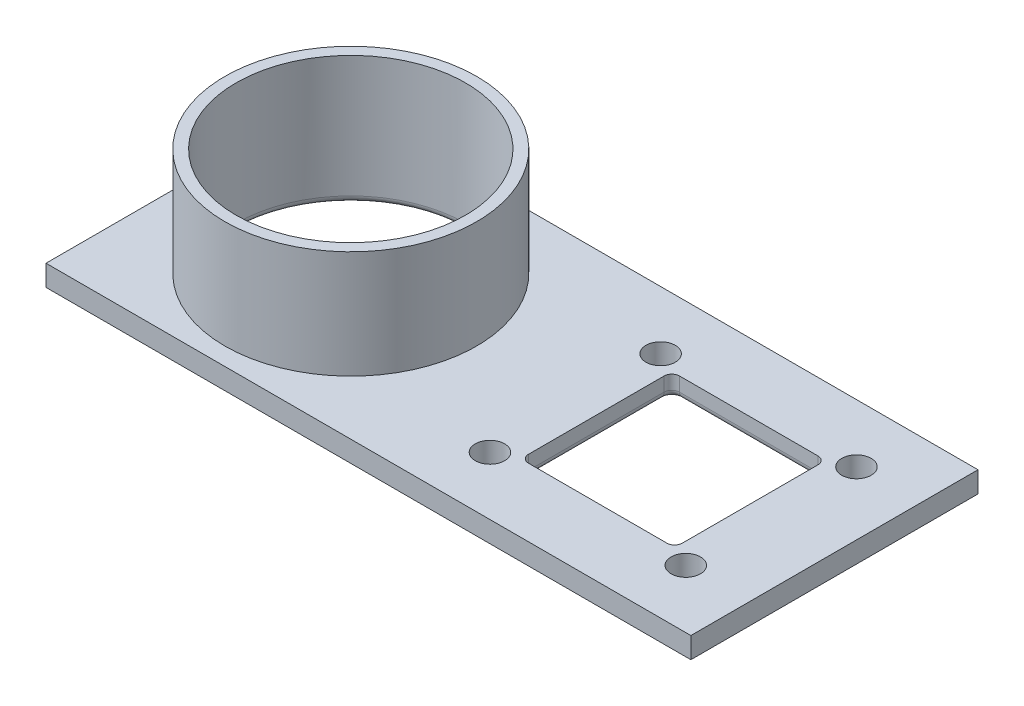
ISO-10303-21;
HEADER;
FILE_DESCRIPTION(('STEP AP214'),'2;1');
FILE_NAME('part.step','',(''),(''),'','','');
FILE_SCHEMA(('AUTOMOTIVE_DESIGN { 1 0 10303 214 1 1 1 1 }'));
ENDSEC;
DATA;
#1=APPLICATION_CONTEXT('core data for automotive mechanical design processes');
#2=APPLICATION_PROTOCOL_DEFINITION('international standard','automotive_design',2000,#1);
#3=PRODUCT_CONTEXT('',#1,'mechanical');
#4=PRODUCT('Part','Part','',(#3));
#5=PRODUCT_RELATED_PRODUCT_CATEGORY('part','',(#4));
#6=PRODUCT_DEFINITION_FORMATION('','',#4);
#7=PRODUCT_DEFINITION_CONTEXT('part definition',#1,'design');
#8=PRODUCT_DEFINITION('design','',#6,#7);
#9=PRODUCT_DEFINITION_SHAPE('','',#8);
#10=(LENGTH_UNIT() NAMED_UNIT(*) SI_UNIT(.MILLI.,.METRE.));
#11=(NAMED_UNIT(*) PLANE_ANGLE_UNIT() SI_UNIT($,.RADIAN.));
#12=(NAMED_UNIT(*) SI_UNIT($,.STERADIAN.) SOLID_ANGLE_UNIT());
#13=UNCERTAINTY_MEASURE_WITH_UNIT(LENGTH_MEASURE(1.E-05),#10,'distance_accuracy_value','');
#14=(GEOMETRIC_REPRESENTATION_CONTEXT(3) GLOBAL_UNCERTAINTY_ASSIGNED_CONTEXT((#13)) GLOBAL_UNIT_ASSIGNED_CONTEXT((#10,
#11,#12)) REPRESENTATION_CONTEXT('',''));
#15=CARTESIAN_POINT('',(0.,0.,0.));
#16=DIRECTION('',(0.,0.,1.));
#17=DIRECTION('',(1.,0.,0.));
#18=AXIS2_PLACEMENT_3D('',#15,#16,#17);
#19=CARTESIAN_POINT('',(0.,1.5,0.));
#20=DIRECTION('',(0.,-1.,0.));
#21=DIRECTION('',(0.,0.,-1.));
#22=AXIS2_PLACEMENT_3D('',#19,#20,#21);
#23=PLANE('',#22);
#24=CARTESIAN_POINT('',(-11.5244365156373,1.5,0.));
#25=DIRECTION('',(0.,-1.,0.));
#26=DIRECTION('',(0.,0.,-1.));
#27=AXIS2_PLACEMENT_3D('',#24,#25,#26);
#28=CIRCLE('',#27,9.);
#29=CARTESIAN_POINT('',(-11.5244365156373,1.5,-9.));
#30=VERTEX_POINT('',#29);
#31=EDGE_CURVE('E235',#30,#30,#28,.F.);
#32=ORIENTED_EDGE('',*,*,#31,.F.);
#33=EDGE_LOOP('',(#32));
#34=FACE_BOUND('',#33,.T.);
#35=CARTESIAN_POINT('',(4.52443651563732,1.5,6.1));
#36=DIRECTION('',(0.,1.,0.));
#37=DIRECTION('',(0.,0.,-1.));
#38=AXIS2_PLACEMENT_3D('',#35,#36,#37);
#39=CIRCLE('',#38,1.05);
#40=CARTESIAN_POINT('',(4.52443651563732,1.5,5.05));
#41=VERTEX_POINT('',#40);
#42=EDGE_CURVE('E448',#41,#41,#39,.T.);
#43=ORIENTED_EDGE('',*,*,#42,.F.);
#44=EDGE_LOOP('',(#43));
#45=FACE_BOUND('',#44,.T.);
#46=CARTESIAN_POINT('',(18.5244365156373,1.5,6.1));
#47=DIRECTION('',(0.,1.,0.));
#48=DIRECTION('',(0.,0.,-1.));
#49=AXIS2_PLACEMENT_3D('',#46,#47,#48);
#50=CIRCLE('',#49,1.05);
#51=CARTESIAN_POINT('',(18.5244365156373,1.5,5.05));
#52=VERTEX_POINT('',#51);
#53=EDGE_CURVE('E456',#52,#52,#50,.T.);
#54=ORIENTED_EDGE('',*,*,#53,.F.);
#55=EDGE_LOOP('',(#54));
#56=FACE_BOUND('',#55,.T.);
#57=CARTESIAN_POINT('',(18.5244365156373,1.5,-6.1));
#58=DIRECTION('',(0.,1.,0.));
#59=DIRECTION('',(0.,0.,1.));
#60=AXIS2_PLACEMENT_3D('',#57,#58,#59);
#61=CIRCLE('',#60,1.05);
#62=CARTESIAN_POINT('',(18.5244365156373,1.5,-5.05));
#63=VERTEX_POINT('',#62);
#64=EDGE_CURVE('E464',#63,#63,#61,.T.);
#65=ORIENTED_EDGE('',*,*,#64,.F.);
#66=EDGE_LOOP('',(#65));
#67=FACE_BOUND('',#66,.T.);
#68=CARTESIAN_POINT('',(4.52443651563732,1.5,-6.1));
#69=DIRECTION('',(0.,1.,0.));
#70=DIRECTION('',(0.,0.,1.));
#71=AXIS2_PLACEMENT_3D('',#68,#69,#70);
#72=CIRCLE('',#71,1.05);
#73=CARTESIAN_POINT('',(4.52443651563732,1.5,-5.05));
#74=VERTEX_POINT('',#73);
#75=EDGE_CURVE('E472',#74,#74,#72,.T.);
#76=ORIENTED_EDGE('',*,*,#75,.F.);
#77=EDGE_LOOP('',(#76));
#78=FACE_BOUND('',#77,.T.);
#79=DIRECTION('',(0.,0.,-1.));
#80=VECTOR('',#79,1.);
#81=CARTESIAN_POINT('',(23.0488730312746,1.5,10.2628876841373));
#82=LINE('',#81,#80);
#83=CARTESIAN_POINT('',(23.0488730312746,1.5,10.2628876841373));
#84=VERTEX_POINT('',#83);
#85=CARTESIAN_POINT('',(23.0488730312746,1.5,-10.2628876841373));
#86=VERTEX_POINT('',#85);
#87=EDGE_CURVE('E175',#84,#86,#82,.T.);
#88=ORIENTED_EDGE('',*,*,#87,.T.);
#89=DIRECTION('',(-1.,0.,0.));
#90=VECTOR('',#89,1.);
#91=CARTESIAN_POINT('',(-23.0488730312746,1.5,-10.2628876841373));
#92=LINE('',#91,#90);
#93=CARTESIAN_POINT('',(-23.0488730312746,1.5,-10.2628876841373));
#94=VERTEX_POINT('',#93);
#95=EDGE_CURVE('E163',#86,#94,#92,.T.);
#96=ORIENTED_EDGE('',*,*,#95,.T.);
#97=DIRECTION('',(0.,0.,1.));
#98=VECTOR('',#97,1.);
#99=CARTESIAN_POINT('',(-23.0488730312746,1.5,10.2628876841373));
#100=LINE('',#99,#98);
#101=CARTESIAN_POINT('',(-23.0488730312746,1.5,10.2628876841373));
#102=VERTEX_POINT('',#101);
#103=EDGE_CURVE('E174',#94,#102,#100,.T.);
#104=ORIENTED_EDGE('',*,*,#103,.T.);
#105=DIRECTION('',(1.,0.,0.));
#106=VECTOR('',#105,1.);
#107=CARTESIAN_POINT('',(-23.0488730312746,1.5,10.2628876841373));
#108=LINE('',#107,#106);
#109=EDGE_CURVE('E180',#102,#84,#108,.T.);
#110=ORIENTED_EDGE('',*,*,#109,.T.);
#111=EDGE_LOOP('',(#88,#96,#104,#110));
#112=FACE_BOUND('',#111,.T.);
#113=DIRECTION('',(0.,0.,-1.));
#114=VECTOR('',#113,1.);
#115=CARTESIAN_POINT('',(6.02443651563732,1.5,5.4));
#116=LINE('',#115,#114);
#117=CARTESIAN_POINT('',(6.02443651563732,1.5,4.85));
#118=VERTEX_POINT('',#117);
#119=CARTESIAN_POINT('',(6.02443651563732,1.5,-4.85));
#120=VERTEX_POINT('',#119);
#121=EDGE_CURVE('E444',#118,#120,#116,.T.);
#122=ORIENTED_EDGE('',*,*,#121,.T.);
#123=CARTESIAN_POINT('',(6.57443651563732,1.5,-4.85));
#124=DIRECTION('',(0.,-1.,0.));
#125=DIRECTION('',(0.,0.,-1.));
#126=AXIS2_PLACEMENT_3D('',#123,#124,#125);
#127=CIRCLE('',#126,0.55);
#128=CARTESIAN_POINT('',(6.57443651563732,1.5,-5.4));
#129=VERTEX_POINT('',#128);
#130=EDGE_CURVE('E232',#120,#129,#127,.T.);
#131=ORIENTED_EDGE('',*,*,#130,.T.);
#132=DIRECTION('',(1.,0.,0.));
#133=VECTOR('',#132,1.);
#134=CARTESIAN_POINT('',(6.02443651563732,1.5,-5.4));
#135=LINE('',#134,#133);
#136=CARTESIAN_POINT('',(16.4744365156373,1.5,-5.4));
#137=VERTEX_POINT('',#136);
#138=EDGE_CURVE('E426',#129,#137,#135,.T.);
#139=ORIENTED_EDGE('',*,*,#138,.T.);
#140=CARTESIAN_POINT('',(16.4744365156373,1.5,-4.85));
#141=DIRECTION('',(0.,-1.,0.));
#142=DIRECTION('',(0.,0.,-1.));
#143=AXIS2_PLACEMENT_3D('',#140,#141,#142);
#144=CIRCLE('',#143,0.55);
#145=CARTESIAN_POINT('',(17.0244365156373,1.5,-4.85));
#146=VERTEX_POINT('',#145);
#147=EDGE_CURVE('E229',#137,#146,#144,.T.);
#148=ORIENTED_EDGE('',*,*,#147,.T.);
#149=DIRECTION('',(0.,0.,-1.));
#150=VECTOR('',#149,1.);
#151=CARTESIAN_POINT('',(17.0244365156373,1.5,5.4));
#152=LINE('',#151,#150);
#153=CARTESIAN_POINT('',(17.0244365156373,1.5,4.85));
#154=VERTEX_POINT('',#153);
#155=EDGE_CURVE('E430',#154,#146,#152,.T.);
#156=ORIENTED_EDGE('',*,*,#155,.F.);
#157=CARTESIAN_POINT('',(16.4744365156373,1.5,4.85));
#158=DIRECTION('',(0.,-1.,0.));
#159=DIRECTION('',(0.,0.,-1.));
#160=AXIS2_PLACEMENT_3D('',#157,#158,#159);
#161=CIRCLE('',#160,0.55);
#162=CARTESIAN_POINT('',(16.4744365156373,1.5,5.4));
#163=VERTEX_POINT('',#162);
#164=EDGE_CURVE('E223',#154,#163,#161,.T.);
#165=ORIENTED_EDGE('',*,*,#164,.T.);
#166=DIRECTION('',(1.,0.,0.));
#167=VECTOR('',#166,1.);
#168=CARTESIAN_POINT('',(6.02443651563732,1.5,5.4));
#169=LINE('',#168,#167);
#170=CARTESIAN_POINT('',(6.57443651563732,1.5,5.4));
#171=VERTEX_POINT('',#170);
#172=EDGE_CURVE('E435',#171,#163,#169,.T.);
#173=ORIENTED_EDGE('',*,*,#172,.F.);
#174=CARTESIAN_POINT('',(6.57443651563732,1.5,4.85));
#175=DIRECTION('',(0.,-1.,0.));
#176=DIRECTION('',(0.,0.,-1.));
#177=AXIS2_PLACEMENT_3D('',#174,#175,#176);
#178=CIRCLE('',#177,0.55);
#179=EDGE_CURVE('E226',#171,#118,#178,.T.);
#180=ORIENTED_EDGE('',*,*,#179,.T.);
#181=EDGE_LOOP('',(#122,#131,#139,#148,#156,#165,#173,#180));
#182=FACE_BOUND('',#181,.T.);
#183=ADVANCED_FACE('F47',(#34,#45,#56,#67,#78,#112,#182),#23,.F.);
#184=CARTESIAN_POINT('',(0.,0.,0.));
#185=DIRECTION('',(0.,-1.,0.));
#186=DIRECTION('',(0.,0.,-1.));
#187=AXIS2_PLACEMENT_3D('',#184,#185,#186);
#188=PLANE('',#187);
#189=CARTESIAN_POINT('',(-11.5244365156373,0.,0.));
#190=DIRECTION('',(0.,-1.,0.));
#191=DIRECTION('',(0.,0.,-1.));
#192=AXIS2_PLACEMENT_3D('',#189,#190,#191);
#193=CIRCLE('',#192,8.7);
#194=CARTESIAN_POINT('',(-11.5244365156373,0.,-8.7));
#195=VERTEX_POINT('',#194);
#196=EDGE_CURVE('E56',#195,#195,#193,.F.);
#197=ORIENTED_EDGE('',*,*,#196,.T.);
#198=EDGE_LOOP('',(#197));
#199=FACE_BOUND('',#198,.T.);
#200=CARTESIAN_POINT('',(16.4744365156373,0.,4.85));
#201=DIRECTION('',(0.,-1.,0.));
#202=DIRECTION('',(0.,0.,-1.));
#203=AXIS2_PLACEMENT_3D('',#200,#201,#202);
#204=CIRCLE('',#203,1.05);
#205=CARTESIAN_POINT('',(16.4744365156373,0.,5.9));
#206=VERTEX_POINT('',#205);
#207=CARTESIAN_POINT('',(17.5244365156373,0.,4.85));
#208=VERTEX_POINT('',#207);
#209=EDGE_CURVE('E257',#206,#208,#204,.F.);
#210=ORIENTED_EDGE('',*,*,#209,.T.);
#211=DIRECTION('',(0.,0.,-1.));
#212=VECTOR('',#211,1.);
#213=CARTESIAN_POINT('',(17.5244365156373,0.,-4.85));
#214=LINE('',#213,#212);
#215=CARTESIAN_POINT('',(17.5244365156373,0.,-4.85));
#216=VERTEX_POINT('',#215);
#217=EDGE_CURVE('E261',#208,#216,#214,.T.);
#218=ORIENTED_EDGE('',*,*,#217,.T.);
#219=CARTESIAN_POINT('',(16.4744365156373,0.,-4.85));
#220=DIRECTION('',(0.,-1.,0.));
#221=DIRECTION('',(0.,0.,-1.));
#222=AXIS2_PLACEMENT_3D('',#219,#220,#221);
#223=CIRCLE('',#222,1.05);
#224=CARTESIAN_POINT('',(16.4744365156373,0.,-5.9));
#225=VERTEX_POINT('',#224);
#226=EDGE_CURVE('E254',#216,#225,#223,.F.);
#227=ORIENTED_EDGE('',*,*,#226,.T.);
#228=DIRECTION('',(1.,0.,0.));
#229=VECTOR('',#228,1.);
#230=CARTESIAN_POINT('',(0.,0.,-5.9));
#231=LINE('',#230,#229);
#232=CARTESIAN_POINT('',(6.57443651563732,0.,-5.9));
#233=VERTEX_POINT('',#232);
#234=EDGE_CURVE('E248',#225,#233,#231,.F.);
#235=ORIENTED_EDGE('',*,*,#234,.T.);
#236=CARTESIAN_POINT('',(6.57443651563732,0.,-4.85));
#237=DIRECTION('',(0.,-1.,0.));
#238=DIRECTION('',(0.,0.,-1.));
#239=AXIS2_PLACEMENT_3D('',#236,#237,#238);
#240=CIRCLE('',#239,1.05);
#241=CARTESIAN_POINT('',(5.52443651563732,0.,-4.85));
#242=VERTEX_POINT('',#241);
#243=EDGE_CURVE('E242',#233,#242,#240,.F.);
#244=ORIENTED_EDGE('',*,*,#243,.T.);
#245=DIRECTION('',(0.,0.,-1.));
#246=VECTOR('',#245,1.);
#247=CARTESIAN_POINT('',(5.52443651563732,0.,0.));
#248=LINE('',#247,#246);
#249=CARTESIAN_POINT('',(5.52443651563732,0.,4.85));
#250=VERTEX_POINT('',#249);
#251=EDGE_CURVE('E239',#242,#250,#248,.F.);
#252=ORIENTED_EDGE('',*,*,#251,.T.);
#253=CARTESIAN_POINT('',(6.57443651563732,0.,4.85));
#254=DIRECTION('',(0.,-1.,0.));
#255=DIRECTION('',(0.,0.,-1.));
#256=AXIS2_PLACEMENT_3D('',#253,#254,#255);
#257=CIRCLE('',#256,1.05);
#258=CARTESIAN_POINT('',(6.57443651563732,0.,5.9));
#259=VERTEX_POINT('',#258);
#260=EDGE_CURVE('E245',#250,#259,#257,.F.);
#261=ORIENTED_EDGE('',*,*,#260,.T.);
#262=DIRECTION('',(1.,0.,0.));
#263=VECTOR('',#262,1.);
#264=CARTESIAN_POINT('',(16.4744365156373,0.,5.9));
#265=LINE('',#264,#263);
#266=EDGE_CURVE('E251',#259,#206,#265,.T.);
#267=ORIENTED_EDGE('',*,*,#266,.T.);
#268=EDGE_LOOP('',(#210,#218,#227,#235,#244,#252,#261,#267));
#269=FACE_BOUND('',#268,.T.);
#270=CARTESIAN_POINT('',(18.5244365156373,0.,6.1));
#271=DIRECTION('',(0.,1.,0.));
#272=DIRECTION('',(0.,0.,-1.));
#273=AXIS2_PLACEMENT_3D('',#270,#271,#272);
#274=CIRCLE('',#273,1.05);
#275=CARTESIAN_POINT('',(18.5244365156373,0.,5.05));
#276=VERTEX_POINT('',#275);
#277=EDGE_CURVE('E452',#276,#276,#274,.T.);
#278=ORIENTED_EDGE('',*,*,#277,.T.);
#279=EDGE_LOOP('',(#278));
#280=FACE_BOUND('',#279,.T.);
#281=CARTESIAN_POINT('',(4.52443651563732,0.,-6.1));
#282=DIRECTION('',(0.,1.,0.));
#283=DIRECTION('',(0.,0.,1.));
#284=AXIS2_PLACEMENT_3D('',#281,#282,#283);
#285=CIRCLE('',#284,1.05);
#286=CARTESIAN_POINT('',(4.52443651563732,0.,-5.05));
#287=VERTEX_POINT('',#286);
#288=EDGE_CURVE('E468',#287,#287,#285,.T.);
#289=ORIENTED_EDGE('',*,*,#288,.T.);
#290=EDGE_LOOP('',(#289));
#291=FACE_BOUND('',#290,.T.);
#292=DIRECTION('',(0.,0.,-1.));
#293=VECTOR('',#292,1.);
#294=CARTESIAN_POINT('',(23.0488730312746,0.,10.2628876841373));
#295=LINE('',#294,#293);
#296=CARTESIAN_POINT('',(23.0488730312746,0.,10.2628876841373));
#297=VERTEX_POINT('',#296);
#298=CARTESIAN_POINT('',(23.0488730312746,0.,-10.2628876841373));
#299=VERTEX_POINT('',#298);
#300=EDGE_CURVE('E189',#297,#299,#295,.T.);
#301=ORIENTED_EDGE('',*,*,#300,.F.);
#302=DIRECTION('',(1.,0.,0.));
#303=VECTOR('',#302,1.);
#304=CARTESIAN_POINT('',(-23.0488730312746,0.,10.2628876841373));
#305=LINE('',#304,#303);
#306=CARTESIAN_POINT('',(-23.0488730312746,0.,10.2628876841373));
#307=VERTEX_POINT('',#306);
#308=EDGE_CURVE('E185',#307,#297,#305,.T.);
#309=ORIENTED_EDGE('',*,*,#308,.F.);
#310=DIRECTION('',(0.,0.,1.));
#311=VECTOR('',#310,1.);
#312=CARTESIAN_POINT('',(-23.0488730312746,0.,10.2628876841373));
#313=LINE('',#312,#311);
#314=CARTESIAN_POINT('',(-23.0488730312746,0.,-10.2628876841373));
#315=VERTEX_POINT('',#314);
#316=EDGE_CURVE('E489',#315,#307,#313,.T.);
#317=ORIENTED_EDGE('',*,*,#316,.F.);
#318=DIRECTION('',(-1.,0.,0.));
#319=VECTOR('',#318,1.);
#320=CARTESIAN_POINT('',(-23.0488730312746,0.,-10.2628876841373));
#321=LINE('',#320,#319);
#322=EDGE_CURVE('E486',#299,#315,#321,.T.);
#323=ORIENTED_EDGE('',*,*,#322,.F.);
#324=EDGE_LOOP('',(#301,#309,#317,#323));
#325=FACE_BOUND('',#324,.T.);
#326=CARTESIAN_POINT('',(18.5244365156373,0.,-6.1));
#327=DIRECTION('',(0.,1.,0.));
#328=DIRECTION('',(0.,0.,1.));
#329=AXIS2_PLACEMENT_3D('',#326,#327,#328);
#330=CIRCLE('',#329,1.05);
#331=CARTESIAN_POINT('',(18.5244365156373,0.,-5.05));
#332=VERTEX_POINT('',#331);
#333=EDGE_CURVE('E460',#332,#332,#330,.T.);
#334=ORIENTED_EDGE('',*,*,#333,.T.);
#335=EDGE_LOOP('',(#334));
#336=FACE_BOUND('',#335,.T.);
#337=CARTESIAN_POINT('',(4.52443651563732,0.,6.1));
#338=DIRECTION('',(0.,1.,0.));
#339=DIRECTION('',(0.,0.,-1.));
#340=AXIS2_PLACEMENT_3D('',#337,#338,#339);
#341=CIRCLE('',#340,1.05);
#342=CARTESIAN_POINT('',(4.52443651563732,0.,5.05));
#343=VERTEX_POINT('',#342);
#344=EDGE_CURVE('E447',#343,#343,#341,.T.);
#345=ORIENTED_EDGE('',*,*,#344,.T.);
#346=EDGE_LOOP('',(#345));
#347=FACE_BOUND('',#346,.T.);
#348=ADVANCED_FACE('F321',(#199,#269,#280,#291,#325,#336,#347),#188,.T.);
#349=CARTESIAN_POINT('',(23.0488730312746,1.5,10.2628876841373));
#350=DIRECTION('',(-1.,0.,0.));
#351=DIRECTION('',(0.,0.,1.));
#352=AXIS2_PLACEMENT_3D('',#349,#350,#351);
#353=PLANE('',#352);
#354=ORIENTED_EDGE('',*,*,#300,.T.);
#355=DIRECTION('',(0.,-1.,0.));
#356=VECTOR('',#355,1.);
#357=CARTESIAN_POINT('',(23.0488730312746,1.5,-10.2628876841373));
#358=LINE('',#357,#356);
#359=EDGE_CURVE('E167',#86,#299,#358,.T.);
#360=ORIENTED_EDGE('',*,*,#359,.F.);
#361=ORIENTED_EDGE('',*,*,#87,.F.);
#362=DIRECTION('',(0.,-1.,0.));
#363=VECTOR('',#362,1.);
#364=CARTESIAN_POINT('',(23.0488730312746,1.5,10.2628876841373));
#365=LINE('',#364,#363);
#366=EDGE_CURVE('E483',#84,#297,#365,.T.);
#367=ORIENTED_EDGE('',*,*,#366,.T.);
#368=EDGE_LOOP('',(#354,#360,#361,#367));
#369=FACE_BOUND('',#368,.T.);
#370=ADVANCED_FACE('F187',(#369),#353,.F.);
#371=CARTESIAN_POINT('',(-23.0488730312746,1.5,-10.2628876841373));
#372=DIRECTION('',(0.,0.,1.));
#373=DIRECTION('',(1.,0.,0.));
#374=AXIS2_PLACEMENT_3D('',#371,#372,#373);
#375=PLANE('',#374);
#376=ORIENTED_EDGE('',*,*,#322,.T.);
#377=DIRECTION('',(0.,-1.,0.));
#378=VECTOR('',#377,1.);
#379=CARTESIAN_POINT('',(-23.0488730312746,1.5,-10.2628876841373));
#380=LINE('',#379,#378);
#381=EDGE_CURVE('E170',#94,#315,#380,.T.);
#382=ORIENTED_EDGE('',*,*,#381,.F.);
#383=ORIENTED_EDGE('',*,*,#95,.F.);
#384=ORIENTED_EDGE('',*,*,#359,.T.);
#385=EDGE_LOOP('',(#376,#382,#383,#384));
#386=FACE_BOUND('',#385,.T.);
#387=ADVANCED_FACE('F165',(#386),#375,.F.);
#388=CARTESIAN_POINT('',(-23.0488730312746,1.5,10.2628876841373));
#389=DIRECTION('',(1.,0.,0.));
#390=DIRECTION('',(0.,0.,-1.));
#391=AXIS2_PLACEMENT_3D('',#388,#389,#390);
#392=PLANE('',#391);
#393=ORIENTED_EDGE('',*,*,#316,.T.);
#394=DIRECTION('',(0.,-1.,0.));
#395=VECTOR('',#394,1.);
#396=CARTESIAN_POINT('',(-23.0488730312746,1.5,10.2628876841373));
#397=LINE('',#396,#395);
#398=EDGE_CURVE('E198',#102,#307,#397,.T.);
#399=ORIENTED_EDGE('',*,*,#398,.F.);
#400=ORIENTED_EDGE('',*,*,#103,.F.);
#401=ORIENTED_EDGE('',*,*,#381,.T.);
#402=EDGE_LOOP('',(#393,#399,#400,#401));
#403=FACE_BOUND('',#402,.T.);
#404=ADVANCED_FACE('F353',(#403),#392,.F.);
#405=CARTESIAN_POINT('',(-23.0488730312746,1.5,10.2628876841373));
#406=DIRECTION('',(0.,0.,-1.));
#407=DIRECTION('',(-1.,0.,0.));
#408=AXIS2_PLACEMENT_3D('',#405,#406,#407);
#409=PLANE('',#408);
#410=ORIENTED_EDGE('',*,*,#308,.T.);
#411=ORIENTED_EDGE('',*,*,#366,.F.);
#412=ORIENTED_EDGE('',*,*,#109,.F.);
#413=ORIENTED_EDGE('',*,*,#398,.T.);
#414=EDGE_LOOP('',(#410,#411,#412,#413));
#415=FACE_BOUND('',#414,.T.);
#416=ADVANCED_FACE('F350',(#415),#409,.F.);
#417=CARTESIAN_POINT('',(4.52443651563732,1.5,-6.1));
#418=DIRECTION('',(0.,-1.,0.));
#419=DIRECTION('',(0.,0.,-1.));
#420=AXIS2_PLACEMENT_3D('',#417,#418,#419);
#421=CYLINDRICAL_SURFACE('',#420,1.05);
#422=ORIENTED_EDGE('',*,*,#75,.T.);
#423=EDGE_LOOP('',(#422));
#424=FACE_BOUND('',#423,.T.);
#425=ORIENTED_EDGE('',*,*,#288,.F.);
#426=EDGE_LOOP('',(#425));
#427=FACE_BOUND('',#426,.T.);
#428=ADVANCED_FACE('F347',(#424,#427),#421,.F.);
#429=CARTESIAN_POINT('',(18.5244365156373,1.5,-6.1));
#430=DIRECTION('',(0.,-1.,0.));
#431=DIRECTION('',(0.,0.,-1.));
#432=AXIS2_PLACEMENT_3D('',#429,#430,#431);
#433=CYLINDRICAL_SURFACE('',#432,1.05);
#434=ORIENTED_EDGE('',*,*,#64,.T.);
#435=EDGE_LOOP('',(#434));
#436=FACE_BOUND('',#435,.T.);
#437=ORIENTED_EDGE('',*,*,#333,.F.);
#438=EDGE_LOOP('',(#437));
#439=FACE_BOUND('',#438,.T.);
#440=ADVANCED_FACE('F516',(#436,#439),#433,.F.);
#441=CARTESIAN_POINT('',(18.5244365156373,1.5,6.1));
#442=DIRECTION('',(0.,-1.,0.));
#443=DIRECTION('',(0.,0.,-1.));
#444=AXIS2_PLACEMENT_3D('',#441,#442,#443);
#445=CYLINDRICAL_SURFACE('',#444,1.05);
#446=ORIENTED_EDGE('',*,*,#53,.T.);
#447=EDGE_LOOP('',(#446));
#448=FACE_BOUND('',#447,.T.);
#449=ORIENTED_EDGE('',*,*,#277,.F.);
#450=EDGE_LOOP('',(#449));
#451=FACE_BOUND('',#450,.T.);
#452=ADVANCED_FACE('F507',(#448,#451),#445,.F.);
#453=CARTESIAN_POINT('',(4.52443651563732,1.5,6.1));
#454=DIRECTION('',(0.,-1.,0.));
#455=DIRECTION('',(0.,0.,-1.));
#456=AXIS2_PLACEMENT_3D('',#453,#454,#455);
#457=CYLINDRICAL_SURFACE('',#456,1.05);
#458=ORIENTED_EDGE('',*,*,#42,.T.);
#459=EDGE_LOOP('',(#458));
#460=FACE_BOUND('',#459,.T.);
#461=ORIENTED_EDGE('',*,*,#344,.F.);
#462=EDGE_LOOP('',(#461));
#463=FACE_BOUND('',#462,.T.);
#464=ADVANCED_FACE('F506',(#460,#463),#457,.F.);
#465=CARTESIAN_POINT('',(6.02443651563732,0.,-5.4));
#466=DIRECTION('',(0.,0.,1.));
#467=DIRECTION('',(1.,0.,0.));
#468=AXIS2_PLACEMENT_3D('',#465,#466,#467);
#469=PLANE('',#468);
#470=DIRECTION('',(0.,1.,0.));
#471=VECTOR('',#470,1.);
#472=CARTESIAN_POINT('',(6.57443651563732,0.,-5.4));
#473=LINE('',#472,#471);
#474=CARTESIAN_POINT('',(6.57443651563732,0.5,-5.4));
#475=VERTEX_POINT('',#474);
#476=EDGE_CURVE('E217',#129,#475,#473,.F.);
#477=ORIENTED_EDGE('',*,*,#476,.T.);
#478=DIRECTION('',(1.,0.,0.));
#479=VECTOR('',#478,1.);
#480=CARTESIAN_POINT('',(6.02443651563732,0.5,-5.4));
#481=LINE('',#480,#479);
#482=CARTESIAN_POINT('',(16.4744365156373,0.5,-5.4));
#483=VERTEX_POINT('',#482);
#484=EDGE_CURVE('E282',#475,#483,#481,.T.);
#485=ORIENTED_EDGE('',*,*,#484,.T.);
#486=DIRECTION('',(0.,1.,0.));
#487=VECTOR('',#486,1.);
#488=CARTESIAN_POINT('',(16.4744365156373,0.,-5.4));
#489=LINE('',#488,#487);
#490=EDGE_CURVE('E220',#483,#137,#489,.T.);
#491=ORIENTED_EDGE('',*,*,#490,.T.);
#492=ORIENTED_EDGE('',*,*,#138,.F.);
#493=EDGE_LOOP('',(#477,#485,#491,#492));
#494=FACE_BOUND('',#493,.T.);
#495=ADVANCED_FACE('F419',(#494),#469,.T.);
#496=CARTESIAN_POINT('',(17.0244365156373,0.,5.4));
#497=DIRECTION('',(1.,0.,0.));
#498=DIRECTION('',(0.,0.,-1.));
#499=AXIS2_PLACEMENT_3D('',#496,#497,#498);
#500=PLANE('',#499);
#501=DIRECTION('',(0.,1.,0.));
#502=VECTOR('',#501,1.);
#503=CARTESIAN_POINT('',(17.0244365156373,0.,-4.85));
#504=LINE('',#503,#502);
#505=CARTESIAN_POINT('',(17.0244365156373,0.5,-4.85));
#506=VERTEX_POINT('',#505);
#507=EDGE_CURVE('E191',#146,#506,#504,.F.);
#508=ORIENTED_EDGE('',*,*,#507,.T.);
#509=DIRECTION('',(0.,0.,-1.));
#510=VECTOR('',#509,1.);
#511=CARTESIAN_POINT('',(17.0244365156373,0.5,4.85));
#512=LINE('',#511,#510);
#513=CARTESIAN_POINT('',(17.0244365156373,0.5,4.85));
#514=VERTEX_POINT('',#513);
#515=EDGE_CURVE('E279',#506,#514,#512,.F.);
#516=ORIENTED_EDGE('',*,*,#515,.T.);
#517=DIRECTION('',(0.,1.,0.));
#518=VECTOR('',#517,1.);
#519=CARTESIAN_POINT('',(17.0244365156373,1.5,4.85));
#520=LINE('',#519,#518);
#521=EDGE_CURVE('E196',#514,#154,#520,.T.);
#522=ORIENTED_EDGE('',*,*,#521,.T.);
#523=ORIENTED_EDGE('',*,*,#155,.T.);
#524=EDGE_LOOP('',(#508,#516,#522,#523));
#525=FACE_BOUND('',#524,.T.);
#526=ADVANCED_FACE('F514',(#525),#500,.F.);
#527=CARTESIAN_POINT('',(6.02443651563732,0.,5.4));
#528=DIRECTION('',(0.,0.,1.));
#529=DIRECTION('',(1.,0.,0.));
#530=AXIS2_PLACEMENT_3D('',#527,#528,#529);
#531=PLANE('',#530);
#532=DIRECTION('',(0.,1.,0.));
#533=VECTOR('',#532,1.);
#534=CARTESIAN_POINT('',(16.4744365156373,0.,5.4));
#535=LINE('',#534,#533);
#536=CARTESIAN_POINT('',(16.4744365156373,0.5,5.4));
#537=VERTEX_POINT('',#536);
#538=EDGE_CURVE('E207',#163,#537,#535,.F.);
#539=ORIENTED_EDGE('',*,*,#538,.T.);
#540=DIRECTION('',(1.,0.,0.));
#541=VECTOR('',#540,1.);
#542=CARTESIAN_POINT('',(6.57443651563732,0.5,5.4));
#543=LINE('',#542,#541);
#544=CARTESIAN_POINT('',(6.57443651563732,0.5,5.4));
#545=VERTEX_POINT('',#544);
#546=EDGE_CURVE('E276',#537,#545,#543,.F.);
#547=ORIENTED_EDGE('',*,*,#546,.T.);
#548=DIRECTION('',(0.,1.,0.));
#549=VECTOR('',#548,1.);
#550=CARTESIAN_POINT('',(6.57443651563732,0.,5.4));
#551=LINE('',#550,#549);
#552=EDGE_CURVE('E204',#545,#171,#551,.T.);
#553=ORIENTED_EDGE('',*,*,#552,.T.);
#554=ORIENTED_EDGE('',*,*,#172,.T.);
#555=EDGE_LOOP('',(#539,#547,#553,#554));
#556=FACE_BOUND('',#555,.T.);
#557=ADVANCED_FACE('F597',(#556),#531,.F.);
#558=CARTESIAN_POINT('',(6.02443651563732,0.,5.4));
#559=DIRECTION('',(1.,0.,0.));
#560=DIRECTION('',(0.,0.,-1.));
#561=AXIS2_PLACEMENT_3D('',#558,#559,#560);
#562=PLANE('',#561);
#563=DIRECTION('',(0.,1.,0.));
#564=VECTOR('',#563,1.);
#565=CARTESIAN_POINT('',(6.02443651563732,0.,4.85));
#566=LINE('',#565,#564);
#567=CARTESIAN_POINT('',(6.02443651563732,0.5,4.85));
#568=VERTEX_POINT('',#567);
#569=EDGE_CURVE('E214',#118,#568,#566,.F.);
#570=ORIENTED_EDGE('',*,*,#569,.T.);
#571=DIRECTION('',(0.,0.,-1.));
#572=VECTOR('',#571,1.);
#573=CARTESIAN_POINT('',(6.02443651563732,0.5,5.4));
#574=LINE('',#573,#572);
#575=CARTESIAN_POINT('',(6.02443651563732,0.5,-4.85));
#576=VERTEX_POINT('',#575);
#577=EDGE_CURVE('E63',#568,#576,#574,.T.);
#578=ORIENTED_EDGE('',*,*,#577,.T.);
#579=DIRECTION('',(0.,1.,0.));
#580=VECTOR('',#579,1.);
#581=CARTESIAN_POINT('',(6.02443651563732,1.5,-4.85));
#582=LINE('',#581,#580);
#583=EDGE_CURVE('E211',#576,#120,#582,.T.);
#584=ORIENTED_EDGE('',*,*,#583,.T.);
#585=ORIENTED_EDGE('',*,*,#121,.F.);
#586=EDGE_LOOP('',(#570,#578,#584,#585));
#587=FACE_BOUND('',#586,.T.);
#588=ADVANCED_FACE('F366',(#587),#562,.T.);
#589=CARTESIAN_POINT('',(16.4744365156373,0.,4.85));
#590=DIRECTION('',(0.,-1.,0.));
#591=DIRECTION('',(0.,0.,-1.));
#592=AXIS2_PLACEMENT_3D('',#589,#590,#591);
#593=CYLINDRICAL_SURFACE('',#592,0.55);
#594=ORIENTED_EDGE('',*,*,#521,.F.);
#595=CARTESIAN_POINT('',(16.4744365156373,0.5,4.85));
#596=DIRECTION('',(0.,-1.,0.));
#597=DIRECTION('',(0.,0.,-1.));
#598=AXIS2_PLACEMENT_3D('',#595,#596,#597);
#599=CIRCLE('',#598,0.55);
#600=EDGE_CURVE('E264',#514,#537,#599,.T.);
#601=ORIENTED_EDGE('',*,*,#600,.T.);
#602=ORIENTED_EDGE('',*,*,#538,.F.);
#603=ORIENTED_EDGE('',*,*,#164,.F.);
#604=EDGE_LOOP('',(#594,#601,#602,#603));
#605=FACE_BOUND('',#604,.T.);
#606=ADVANCED_FACE('F362',(#605),#593,.F.);
#607=CARTESIAN_POINT('',(6.57443651563732,0.,4.85));
#608=DIRECTION('',(0.,1.,0.));
#609=DIRECTION('',(0.,0.,1.));
#610=AXIS2_PLACEMENT_3D('',#607,#608,#609);
#611=CYLINDRICAL_SURFACE('',#610,0.55);
#612=ORIENTED_EDGE('',*,*,#552,.F.);
#613=CARTESIAN_POINT('',(6.57443651563732,0.5,4.85));
#614=DIRECTION('',(0.,-1.,0.));
#615=DIRECTION('',(0.,0.,-1.));
#616=AXIS2_PLACEMENT_3D('',#613,#614,#615);
#617=CIRCLE('',#616,0.55);
#618=EDGE_CURVE('E271',#545,#568,#617,.T.);
#619=ORIENTED_EDGE('',*,*,#618,.T.);
#620=ORIENTED_EDGE('',*,*,#569,.F.);
#621=ORIENTED_EDGE('',*,*,#179,.F.);
#622=EDGE_LOOP('',(#612,#619,#620,#621));
#623=FACE_BOUND('',#622,.T.);
#624=ADVANCED_FACE('F365',(#623),#611,.F.);
#625=CARTESIAN_POINT('',(16.4744365156373,0.,-4.85));
#626=DIRECTION('',(0.,1.,0.));
#627=DIRECTION('',(0.,0.,1.));
#628=AXIS2_PLACEMENT_3D('',#625,#626,#627);
#629=CYLINDRICAL_SURFACE('',#628,0.55);
#630=ORIENTED_EDGE('',*,*,#490,.F.);
#631=CARTESIAN_POINT('',(16.4744365156373,0.5,-4.85));
#632=DIRECTION('',(0.,-1.,0.));
#633=DIRECTION('',(0.,0.,-1.));
#634=AXIS2_PLACEMENT_3D('',#631,#632,#633);
#635=CIRCLE('',#634,0.55);
#636=EDGE_CURVE('E268',#483,#506,#635,.T.);
#637=ORIENTED_EDGE('',*,*,#636,.T.);
#638=ORIENTED_EDGE('',*,*,#507,.F.);
#639=ORIENTED_EDGE('',*,*,#147,.F.);
#640=EDGE_LOOP('',(#630,#637,#638,#639));
#641=FACE_BOUND('',#640,.T.);
#642=ADVANCED_FACE('F370',(#641),#629,.F.);
#643=CARTESIAN_POINT('',(6.57443651563732,0.,-4.85));
#644=DIRECTION('',(0.,-1.,0.));
#645=DIRECTION('',(0.,0.,-1.));
#646=AXIS2_PLACEMENT_3D('',#643,#644,#645);
#647=CYLINDRICAL_SURFACE('',#646,0.55);
#648=ORIENTED_EDGE('',*,*,#583,.F.);
#649=CARTESIAN_POINT('',(6.57443651563732,0.5,-4.85));
#650=DIRECTION('',(0.,-1.,0.));
#651=DIRECTION('',(0.,0.,-1.));
#652=AXIS2_PLACEMENT_3D('',#649,#650,#651);
#653=CIRCLE('',#652,0.55);
#654=EDGE_CURVE('E70',#576,#475,#653,.T.);
#655=ORIENTED_EDGE('',*,*,#654,.T.);
#656=ORIENTED_EDGE('',*,*,#476,.F.);
#657=ORIENTED_EDGE('',*,*,#130,.F.);
#658=EDGE_LOOP('',(#648,#655,#656,#657));
#659=FACE_BOUND('',#658,.T.);
#660=ADVANCED_FACE('F374',(#659),#647,.F.);
#661=CARTESIAN_POINT('',(-11.5244365156373,9.2,0.));
#662=DIRECTION('',(0.,-1.,0.));
#663=DIRECTION('',(0.,0.,-1.));
#664=AXIS2_PLACEMENT_3D('',#661,#662,#663);
#665=CYLINDRICAL_SURFACE('',#664,9.);
#666=CARTESIAN_POINT('',(-11.5244365156373,9.2,0.));
#667=DIRECTION('',(0.,1.,0.));
#668=DIRECTION('',(0.,0.,1.));
#669=AXIS2_PLACEMENT_3D('',#666,#667,#668);
#670=CIRCLE('',#669,9.);
#671=CARTESIAN_POINT('',(-11.5244365156373,9.2,-9.));
#672=VERTEX_POINT('',#671);
#673=EDGE_CURVE('E431',#672,#672,#670,.T.);
#674=CARTESIAN_POINT('',(-11.5244365156373,9.2,-9.));
#675=CARTESIAN_POINT('',(-11.5244365156373,9.11979166666667,-9.));
#676=CARTESIAN_POINT('',(-11.5244365156373,9.03958333333333,-9.));
#677=CARTESIAN_POINT('',(-11.5244365156373,8.87916666666666,-9.));
#678=CARTESIAN_POINT('',(-11.5244365156373,8.79895833333333,-9.));
#679=CARTESIAN_POINT('',(-11.5244365156373,8.63854166666667,-9.));
#680=CARTESIAN_POINT('',(-11.5244365156373,8.55833333333333,-9.));
#681=CARTESIAN_POINT('',(-11.5244365156373,8.39791666666667,-9.));
#682=CARTESIAN_POINT('',(-11.5244365156373,8.31770833333333,-9.));
#683=CARTESIAN_POINT('',(-11.5244365156373,8.15729166666667,-9.));
#684=CARTESIAN_POINT('',(-11.5244365156373,8.07708333333333,-9.));
#685=CARTESIAN_POINT('',(-11.5244365156373,7.91666666666667,-9.));
#686=CARTESIAN_POINT('',(-11.5244365156373,7.83645833333333,-9.));
#687=CARTESIAN_POINT('',(-11.5244365156373,7.67604166666667,-9.));
#688=CARTESIAN_POINT('',(-11.5244365156373,7.59583333333333,-9.));
#689=CARTESIAN_POINT('',(-11.5244365156373,7.43541666666667,-9.));
#690=CARTESIAN_POINT('',(-11.5244365156373,7.35520833333333,-9.));
#691=CARTESIAN_POINT('',(-11.5244365156373,7.19479166666667,-9.));
#692=CARTESIAN_POINT('',(-11.5244365156373,7.11458333333333,-9.));
#693=CARTESIAN_POINT('',(-11.5244365156373,6.95416666666667,-9.));
#694=CARTESIAN_POINT('',(-11.5244365156373,6.87395833333333,-9.));
#695=CARTESIAN_POINT('',(-11.5244365156373,6.71354166666667,-9.));
#696=CARTESIAN_POINT('',(-11.5244365156373,6.63333333333333,-9.));
#697=CARTESIAN_POINT('',(-11.5244365156373,6.47291666666667,-9.));
#698=CARTESIAN_POINT('',(-11.5244365156373,6.39270833333333,-9.));
#699=CARTESIAN_POINT('',(-11.5244365156373,6.23229166666667,-9.));
#700=CARTESIAN_POINT('',(-11.5244365156373,6.15208333333333,-9.));
#701=CARTESIAN_POINT('',(-11.5244365156373,5.99166666666667,-9.));
#702=CARTESIAN_POINT('',(-11.5244365156373,5.91145833333333,-9.));
#703=CARTESIAN_POINT('',(-11.5244365156373,5.75104166666667,-9.));
#704=CARTESIAN_POINT('',(-11.5244365156373,5.67083333333333,-9.));
#705=CARTESIAN_POINT('',(-11.5244365156373,5.51041666666667,-9.));
#706=CARTESIAN_POINT('',(-11.5244365156373,5.43020833333333,-9.));
#707=CARTESIAN_POINT('',(-11.5244365156373,5.26979166666667,-9.));
#708=CARTESIAN_POINT('',(-11.5244365156373,5.18958333333333,-9.));
#709=CARTESIAN_POINT('',(-11.5244365156373,5.02916666666667,-9.));
#710=CARTESIAN_POINT('',(-11.5244365156373,4.94895833333333,-9.));
#711=CARTESIAN_POINT('',(-11.5244365156373,4.78854166666667,-9.));
#712=CARTESIAN_POINT('',(-11.5244365156373,4.70833333333333,-9.));
#713=CARTESIAN_POINT('',(-11.5244365156373,4.54791666666667,-9.));
#714=CARTESIAN_POINT('',(-11.5244365156373,4.46770833333333,-9.));
#715=CARTESIAN_POINT('',(-11.5244365156373,4.30729166666667,-9.));
#716=CARTESIAN_POINT('',(-11.5244365156373,4.22708333333333,-9.));
#717=CARTESIAN_POINT('',(-11.5244365156373,4.06666666666667,-9.));
#718=CARTESIAN_POINT('',(-11.5244365156373,3.98645833333333,-9.));
#719=CARTESIAN_POINT('',(-11.5244365156373,3.82604166666667,-9.));
#720=CARTESIAN_POINT('',(-11.5244365156373,3.74583333333333,-9.));
#721=CARTESIAN_POINT('',(-11.5244365156373,3.58541666666667,-9.));
#722=CARTESIAN_POINT('',(-11.5244365156373,3.50520833333333,-9.));
#723=CARTESIAN_POINT('',(-11.5244365156373,3.34479166666667,-9.));
#724=CARTESIAN_POINT('',(-11.5244365156373,3.26458333333333,-9.));
#725=CARTESIAN_POINT('',(-11.5244365156373,3.10416666666667,-9.));
#726=CARTESIAN_POINT('',(-11.5244365156373,3.02395833333333,-9.));
#727=CARTESIAN_POINT('',(-11.5244365156373,2.86354166666667,-9.));
#728=CARTESIAN_POINT('',(-11.5244365156373,2.78333333333333,-9.));
#729=CARTESIAN_POINT('',(-11.5244365156373,2.62291666666667,-9.));
#730=CARTESIAN_POINT('',(-11.5244365156373,2.54270833333333,-9.));
#731=CARTESIAN_POINT('',(-11.5244365156373,2.38229166666667,-9.));
#732=CARTESIAN_POINT('',(-11.5244365156373,2.30208333333333,-9.));
#733=CARTESIAN_POINT('',(-11.5244365156373,2.14166666666667,-9.));
#734=CARTESIAN_POINT('',(-11.5244365156373,2.06145833333333,-9.));
#735=CARTESIAN_POINT('',(-11.5244365156373,1.90104166666667,-9.));
#736=CARTESIAN_POINT('',(-11.5244365156373,1.82083333333333,-9.));
#737=CARTESIAN_POINT('',(-11.5244365156373,1.66041666666667,-9.));
#738=CARTESIAN_POINT('',(-11.5244365156373,1.58020833333333,-9.));
#739=CARTESIAN_POINT('',(-11.5244365156373,1.5,-9.));
#740=B_SPLINE_CURVE_WITH_KNOTS('',3,(#674,#675,#676,#677,#678,#679,#680,#681,#682,#683,#684,
#685,#686,#687,#688,#689,#690,#691,#692,#693,#694,#695,#696,#697,#698,#699,#700,#701,#702,#703,
#704,#705,#706,#707,#708,#709,#710,#711,#712,#713,#714,#715,#716,#717,#718,#719,#720,#721,#722,
#723,#724,#725,#726,#727,#728,#729,#730,#731,#732,#733,#734,#735,#736,#737,#738,#739),
.UNSPECIFIED.,.F.,.F.,(4,2,2,2,2,2,2,2,2,2,2,2,2,2,2,2,2,2,2,2,2,2,2,2,2,2,2,2,2,2,2,2,4),(0.,
0.240625000000001,0.481250000000001,0.721875,0.962500000000002,1.203125,1.44375,1.684375,1.925,
2.165625,2.40625,2.646875,2.8875,3.128125,3.36875,3.609375,3.85,4.090625,4.33125,4.571875,
4.8125,5.053125,5.29375,5.534375,5.775,6.015625,6.25625,6.496875,6.7375,6.978125,7.21875,
7.459375,7.7),.UNSPECIFIED.);
#741=EDGE_CURVE('BSEAM377',#672,#30,#740,.T.);
#742=ORIENTED_EDGE('',*,*,#673,.F.);
#743=ORIENTED_EDGE('',*,*,#31,.T.);
#744=ORIENTED_EDGE('',*,*,#741,.T.);
#745=ORIENTED_EDGE('',*,*,#741,.F.);
#746=EDGE_LOOP('',(#742,#744,#743,#745));
#747=FACE_BOUND('',#746,.T.);
#748=ADVANCED_FACE('F377',(#747),#665,.T.);
#749=CARTESIAN_POINT('',(-11.5244365156373,9.2,0.));
#750=DIRECTION('',(0.,1.,0.));
#751=DIRECTION('',(0.,0.,1.));
#752=AXIS2_PLACEMENT_3D('',#749,#750,#751);
#753=PLANE('',#752);
#754=CARTESIAN_POINT('',(-11.5244365156373,9.2,0.));
#755=DIRECTION('',(0.,1.,0.));
#756=DIRECTION('',(0.,0.,1.));
#757=AXIS2_PLACEMENT_3D('',#754,#755,#756);
#758=CIRCLE('',#757,8.2);
#759=CARTESIAN_POINT('',(-11.5244365156373,9.2,8.2));
#760=VERTEX_POINT('',#759);
#761=EDGE_CURVE('E316',#760,#760,#758,.T.);
#762=ORIENTED_EDGE('',*,*,#761,.F.);
#763=EDGE_LOOP('',(#762));
#764=FACE_BOUND('',#763,.T.);
#765=ORIENTED_EDGE('',*,*,#673,.T.);
#766=EDGE_LOOP('',(#765));
#767=FACE_BOUND('',#766,.T.);
#768=ADVANCED_FACE('F407',(#764,#767),#753,.T.);
#769=CARTESIAN_POINT('',(-11.5244365156373,0.,0.));
#770=DIRECTION('',(0.,1.,0.));
#771=DIRECTION('',(0.,0.,1.));
#772=AXIS2_PLACEMENT_3D('',#769,#770,#771);
#773=CYLINDRICAL_SURFACE('',#772,8.2);
#774=CARTESIAN_POINT('',(-11.5244365156373,0.5,0.));
#775=DIRECTION('',(0.,-1.,0.));
#776=DIRECTION('',(0.,0.,-1.));
#777=AXIS2_PLACEMENT_3D('',#774,#775,#776);
#778=CIRCLE('',#777,8.2);
#779=CARTESIAN_POINT('',(-11.5244365156373,0.5,-8.2));
#780=VERTEX_POINT('',#779);
#781=EDGE_CURVE('E11',#780,#780,#778,.T.);
#782=ORIENTED_EDGE('',*,*,#781,.T.);
#783=EDGE_LOOP('',(#782));
#784=FACE_BOUND('',#783,.T.);
#785=ORIENTED_EDGE('',*,*,#761,.T.);
#786=EDGE_LOOP('',(#785));
#787=FACE_BOUND('',#786,.T.);
#788=ADVANCED_FACE('F403',(#784,#787),#773,.F.);
#789=CARTESIAN_POINT('',(6.57443651563732,0.5,-4.85));
#790=DIRECTION('',(0.,-1.,0.));
#791=DIRECTION('',(0.,0.,-1.));
#792=AXIS2_PLACEMENT_3D('',#789,#790,#791);
#793=TOROIDAL_SURFACE('',#792,1.05,0.5);
#794=CARTESIAN_POINT('',(6.57443651563732,0.5,-5.9));
#795=DIRECTION('',(1.,0.,0.));
#796=DIRECTION('',(0.,0.,-1.));
#797=AXIS2_PLACEMENT_3D('',#794,#795,#796);
#798=CIRCLE('',#797,0.5);
#799=EDGE_CURVE('E309',#475,#233,#798,.T.);
#800=ORIENTED_EDGE('',*,*,#799,.F.);
#801=ORIENTED_EDGE('',*,*,#654,.F.);
#802=CARTESIAN_POINT('',(5.52443651563732,0.5,-4.85));
#803=DIRECTION('',(0.,0.,1.));
#804=DIRECTION('',(1.,0.,0.));
#805=AXIS2_PLACEMENT_3D('',#802,#803,#804);
#806=CIRCLE('',#805,0.5);
#807=EDGE_CURVE('E313',#242,#576,#806,.T.);
#808=ORIENTED_EDGE('',*,*,#807,.F.);
#809=ORIENTED_EDGE('',*,*,#243,.F.);
#810=EDGE_LOOP('',(#800,#801,#808,#809));
#811=FACE_BOUND('',#810,.T.);
#812=ADVANCED_FACE('F400',(#811),#793,.T.);
#813=CARTESIAN_POINT('',(5.52443651563732,0.5,5.4));
#814=DIRECTION('',(0.,0.,-1.));
#815=DIRECTION('',(-1.,0.,0.));
#816=AXIS2_PLACEMENT_3D('',#813,#814,#815);
#817=CYLINDRICAL_SURFACE('',#816,0.5);
#818=ORIENTED_EDGE('',*,*,#807,.T.);
#819=ORIENTED_EDGE('',*,*,#577,.F.);
#820=CARTESIAN_POINT('',(5.52443651563732,0.5,4.85));
#821=DIRECTION('',(0.,0.,1.));
#822=DIRECTION('',(1.,0.,0.));
#823=AXIS2_PLACEMENT_3D('',#820,#821,#822);
#824=CIRCLE('',#823,0.5);
#825=EDGE_CURVE('E305',#250,#568,#824,.T.);
#826=ORIENTED_EDGE('',*,*,#825,.F.);
#827=ORIENTED_EDGE('',*,*,#251,.F.);
#828=EDGE_LOOP('',(#818,#819,#826,#827));
#829=FACE_BOUND('',#828,.T.);
#830=ADVANCED_FACE('F397',(#829),#817,.T.);
#831=CARTESIAN_POINT('',(6.02443651563732,0.5,-5.9));
#832=DIRECTION('',(1.,0.,0.));
#833=DIRECTION('',(0.,0.,-1.));
#834=AXIS2_PLACEMENT_3D('',#831,#832,#833);
#835=CYLINDRICAL_SURFACE('',#834,0.5);
#836=ORIENTED_EDGE('',*,*,#799,.T.);
#837=ORIENTED_EDGE('',*,*,#234,.F.);
#838=CARTESIAN_POINT('',(16.4744365156373,0.5,-5.9));
#839=DIRECTION('',(1.,0.,0.));
#840=DIRECTION('',(0.,0.,-1.));
#841=AXIS2_PLACEMENT_3D('',#838,#839,#840);
#842=CIRCLE('',#841,0.5);
#843=EDGE_CURVE('E301',#483,#225,#842,.T.);
#844=ORIENTED_EDGE('',*,*,#843,.F.);
#845=ORIENTED_EDGE('',*,*,#484,.F.);
#846=EDGE_LOOP('',(#836,#837,#844,#845));
#847=FACE_BOUND('',#846,.T.);
#848=ADVANCED_FACE('F393',(#847),#835,.T.);
#849=CARTESIAN_POINT('',(6.57443651563732,0.5,4.85));
#850=DIRECTION('',(0.,-1.,0.));
#851=DIRECTION('',(0.,0.,-1.));
#852=AXIS2_PLACEMENT_3D('',#849,#850,#851);
#853=TOROIDAL_SURFACE('',#852,1.05,0.5);
#854=ORIENTED_EDGE('',*,*,#825,.T.);
#855=ORIENTED_EDGE('',*,*,#618,.F.);
#856=CARTESIAN_POINT('',(6.57443651563732,0.5,5.9));
#857=DIRECTION('',(1.,0.,0.));
#858=DIRECTION('',(0.,0.,-1.));
#859=AXIS2_PLACEMENT_3D('',#856,#857,#858);
#860=CIRCLE('',#859,0.5);
#861=EDGE_CURVE('E297',#259,#545,#860,.T.);
#862=ORIENTED_EDGE('',*,*,#861,.F.);
#863=ORIENTED_EDGE('',*,*,#260,.F.);
#864=EDGE_LOOP('',(#854,#855,#862,#863));
#865=FACE_BOUND('',#864,.T.);
#866=ADVANCED_FACE('F389',(#865),#853,.T.);
#867=CARTESIAN_POINT('',(16.4744365156373,0.5,-4.85));
#868=DIRECTION('',(0.,-1.,0.));
#869=DIRECTION('',(0.,0.,-1.));
#870=AXIS2_PLACEMENT_3D('',#867,#868,#869);
#871=TOROIDAL_SURFACE('',#870,1.05,0.5);
#872=ORIENTED_EDGE('',*,*,#843,.T.);
#873=ORIENTED_EDGE('',*,*,#226,.F.);
#874=CARTESIAN_POINT('',(17.5244365156373,0.5,-4.85));
#875=DIRECTION('',(0.,0.,1.));
#876=DIRECTION('',(1.,0.,0.));
#877=AXIS2_PLACEMENT_3D('',#874,#875,#876);
#878=CIRCLE('',#877,0.5);
#879=EDGE_CURVE('E293',#506,#216,#878,.T.);
#880=ORIENTED_EDGE('',*,*,#879,.F.);
#881=ORIENTED_EDGE('',*,*,#636,.F.);
#882=EDGE_LOOP('',(#872,#873,#880,#881));
#883=FACE_BOUND('',#882,.T.);
#884=ADVANCED_FACE('F385',(#883),#871,.T.);
#885=CARTESIAN_POINT('',(0.,0.5,5.9));
#886=DIRECTION('',(-1.,0.,0.));
#887=DIRECTION('',(0.,0.,1.));
#888=AXIS2_PLACEMENT_3D('',#885,#886,#887);
#889=CYLINDRICAL_SURFACE('',#888,0.5);
#890=ORIENTED_EDGE('',*,*,#861,.T.);
#891=ORIENTED_EDGE('',*,*,#546,.F.);
#892=CARTESIAN_POINT('',(16.4744365156373,0.5,5.9));
#893=DIRECTION('',(1.,0.,0.));
#894=DIRECTION('',(0.,0.,-1.));
#895=AXIS2_PLACEMENT_3D('',#892,#893,#894);
#896=CIRCLE('',#895,0.5);
#897=EDGE_CURVE('E290',#206,#537,#896,.T.);
#898=ORIENTED_EDGE('',*,*,#897,.F.);
#899=ORIENTED_EDGE('',*,*,#266,.F.);
#900=EDGE_LOOP('',(#890,#891,#898,#899));
#901=FACE_BOUND('',#900,.T.);
#902=ADVANCED_FACE('F381',(#901),#889,.T.);
#903=CARTESIAN_POINT('',(17.5244365156373,0.5,0.));
#904=DIRECTION('',(0.,0.,1.));
#905=DIRECTION('',(1.,0.,0.));
#906=AXIS2_PLACEMENT_3D('',#903,#904,#905);
#907=CYLINDRICAL_SURFACE('',#906,0.5);
#908=ORIENTED_EDGE('',*,*,#879,.T.);
#909=ORIENTED_EDGE('',*,*,#217,.F.);
#910=CARTESIAN_POINT('',(17.5244365156373,0.5,4.85));
#911=DIRECTION('',(0.,0.,1.));
#912=DIRECTION('',(1.,0.,0.));
#913=AXIS2_PLACEMENT_3D('',#910,#911,#912);
#914=CIRCLE('',#913,0.5);
#915=EDGE_CURVE('E287',#514,#208,#914,.T.);
#916=ORIENTED_EDGE('',*,*,#915,.F.);
#917=ORIENTED_EDGE('',*,*,#515,.F.);
#918=EDGE_LOOP('',(#908,#909,#916,#917));
#919=FACE_BOUND('',#918,.T.);
#920=ADVANCED_FACE('F331',(#919),#907,.T.);
#921=CARTESIAN_POINT('',(16.4744365156373,0.5,4.85));
#922=DIRECTION('',(0.,-1.,0.));
#923=DIRECTION('',(0.,0.,-1.));
#924=AXIS2_PLACEMENT_3D('',#921,#922,#923);
#925=TOROIDAL_SURFACE('',#924,1.05,0.5);
#926=ORIENTED_EDGE('',*,*,#897,.T.);
#927=ORIENTED_EDGE('',*,*,#600,.F.);
#928=ORIENTED_EDGE('',*,*,#915,.T.);
#929=ORIENTED_EDGE('',*,*,#209,.F.);
#930=EDGE_LOOP('',(#926,#927,#928,#929));
#931=FACE_BOUND('',#930,.T.);
#932=ADVANCED_FACE('F325',(#931),#925,.T.);
#933=CARTESIAN_POINT('',(-11.5244365156373,0.5,0.));
#934=DIRECTION('',(0.,-1.,0.));
#935=DIRECTION('',(0.,0.,-1.));
#936=AXIS2_PLACEMENT_3D('',#933,#934,#935);
#937=TOROIDAL_SURFACE('',#936,8.7,0.5);
#938=ORIENTED_EDGE('',*,*,#781,.F.);
#939=EDGE_LOOP('',(#938));
#940=FACE_BOUND('',#939,.T.);
#941=ORIENTED_EDGE('',*,*,#196,.F.);
#942=EDGE_LOOP('',(#941));
#943=FACE_BOUND('',#942,.T.);
#944=ADVANCED_FACE('F49',(#940,#943),#937,.T.);
#945=CLOSED_SHELL('',(#183,#348,#370,#387,#404,#416,#428,#440,#452,#464,#495,#526,#557,#588,
#606,#624,#642,#660,#748,#768,#788,#812,#830,#848,#866,#884,#902,#920,#932,#944));
#946=MANIFOLD_SOLID_BREP('B2',#945);
#947=ADVANCED_BREP_SHAPE_REPRESENTATION('',(#18,#946),#14);
#948=SHAPE_DEFINITION_REPRESENTATION(#9,#947);
ENDSEC;
END-ISO-10303-21;
